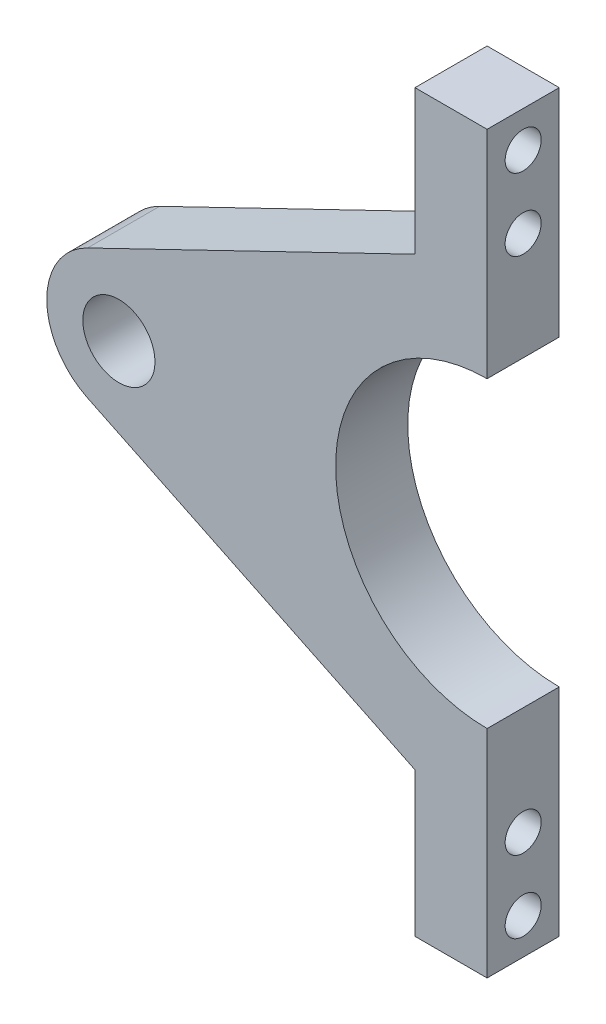
ISO-10303-21;
HEADER;
FILE_DESCRIPTION(('STEP AP214'),'2;1');
FILE_NAME('part.step','',(''),(''),'','','');
FILE_SCHEMA(('AUTOMOTIVE_DESIGN { 1 0 10303 214 1 1 1 1 }'));
ENDSEC;
DATA;
#1=APPLICATION_CONTEXT('core data for automotive mechanical design processes');
#2=APPLICATION_PROTOCOL_DEFINITION('international standard','automotive_design',2000,#1);
#3=PRODUCT_CONTEXT('',#1,'mechanical');
#4=PRODUCT('Part','Part','',(#3));
#5=PRODUCT_RELATED_PRODUCT_CATEGORY('part','',(#4));
#6=PRODUCT_DEFINITION_FORMATION('','',#4);
#7=PRODUCT_DEFINITION_CONTEXT('part definition',#1,'design');
#8=PRODUCT_DEFINITION('design','',#6,#7);
#9=PRODUCT_DEFINITION_SHAPE('','',#8);
#10=(LENGTH_UNIT() NAMED_UNIT(*) SI_UNIT(.MILLI.,.METRE.));
#11=(NAMED_UNIT(*) PLANE_ANGLE_UNIT() SI_UNIT($,.RADIAN.));
#12=(NAMED_UNIT(*) SI_UNIT($,.STERADIAN.) SOLID_ANGLE_UNIT());
#13=UNCERTAINTY_MEASURE_WITH_UNIT(LENGTH_MEASURE(1.E-05),#10,'distance_accuracy_value','');
#14=(GEOMETRIC_REPRESENTATION_CONTEXT(3) GLOBAL_UNCERTAINTY_ASSIGNED_CONTEXT((#13)) GLOBAL_UNIT_ASSIGNED_CONTEXT((#10,
#11,#12)) REPRESENTATION_CONTEXT('',''));
#15=CARTESIAN_POINT('',(0.,0.,0.));
#16=DIRECTION('',(0.,0.,1.));
#17=DIRECTION('',(1.,0.,0.));
#18=AXIS2_PLACEMENT_3D('',#15,#16,#17);
#19=CARTESIAN_POINT('',(0.,54.25,-10.));
#20=DIRECTION('',(0.,1.,0.));
#21=DIRECTION('',(0.,0.,1.));
#22=AXIS2_PLACEMENT_3D('',#19,#20,#21);
#23=PLANE('',#22);
#24=DIRECTION('',(-1.,0.,0.));
#25=VECTOR('',#24,1.);
#26=CARTESIAN_POINT('',(0.,54.25,0.));
#27=LINE('',#26,#25);
#28=CARTESIAN_POINT('',(0.,54.25,0.));
#29=VERTEX_POINT('',#28);
#30=CARTESIAN_POINT('',(-10.,54.25,0.));
#31=VERTEX_POINT('',#30);
#32=EDGE_CURVE('E141',#29,#31,#27,.T.);
#33=ORIENTED_EDGE('',*,*,#32,.F.);
#34=DIRECTION('',(0.,0.,1.));
#35=VECTOR('',#34,1.);
#36=CARTESIAN_POINT('',(0.,54.25,-10.));
#37=LINE('',#36,#35);
#38=CARTESIAN_POINT('',(0.,54.25,-10.));
#39=VERTEX_POINT('',#38);
#40=EDGE_CURVE('E11',#39,#29,#37,.T.);
#41=ORIENTED_EDGE('',*,*,#40,.F.);
#42=DIRECTION('',(-1.,0.,0.));
#43=VECTOR('',#42,1.);
#44=CARTESIAN_POINT('',(0.,54.25,-10.));
#45=LINE('',#44,#43);
#46=CARTESIAN_POINT('',(-10.,54.25,-10.));
#47=VERTEX_POINT('',#46);
#48=EDGE_CURVE('E168',#39,#47,#45,.T.);
#49=ORIENTED_EDGE('',*,*,#48,.T.);
#50=DIRECTION('',(0.,0.,1.));
#51=VECTOR('',#50,1.);
#52=CARTESIAN_POINT('',(-10.,54.25,-10.));
#53=LINE('',#52,#51);
#54=EDGE_CURVE('E35',#47,#31,#53,.T.);
#55=ORIENTED_EDGE('',*,*,#54,.T.);
#56=EDGE_LOOP('',(#33,#41,#49,#55));
#57=FACE_BOUND('',#56,.T.);
#58=ADVANCED_FACE('F32',(#57),#23,.T.);
#59=CARTESIAN_POINT('',(0.,24.2996794871795,-10.));
#60=DIRECTION('',(1.,0.,0.));
#61=DIRECTION('',(0.,0.,-1.));
#62=AXIS2_PLACEMENT_3D('',#59,#60,#61);
#63=PLANE('',#62);
#64=CARTESIAN_POINT('',(0.,49.25,-5.));
#65=DIRECTION('',(-1.,0.,0.));
#66=DIRECTION('',(0.,0.,1.));
#67=AXIS2_PLACEMENT_3D('',#64,#65,#66);
#68=CIRCLE('',#67,2.5);
#69=CARTESIAN_POINT('',(0.,49.25,-2.5));
#70=VERTEX_POINT('',#69);
#71=EDGE_CURVE('E257',#70,#70,#68,.T.);
#72=ORIENTED_EDGE('',*,*,#71,.T.);
#73=EDGE_LOOP('',(#72));
#74=FACE_BOUND('',#73,.T.);
#75=CARTESIAN_POINT('',(0.,39.25,-5.));
#76=DIRECTION('',(-1.,0.,0.));
#77=DIRECTION('',(0.,0.,1.));
#78=AXIS2_PLACEMENT_3D('',#75,#76,#77);
#79=CIRCLE('',#78,2.5);
#80=CARTESIAN_POINT('',(0.,39.25,-2.5));
#81=VERTEX_POINT('',#80);
#82=EDGE_CURVE('E234',#81,#81,#79,.T.);
#83=ORIENTED_EDGE('',*,*,#82,.T.);
#84=EDGE_LOOP('',(#83));
#85=FACE_BOUND('',#84,.T.);
#86=DIRECTION('',(0.,1.,0.));
#87=VECTOR('',#86,1.);
#88=CARTESIAN_POINT('',(0.,24.2996794871795,0.));
#89=LINE('',#88,#87);
#90=CARTESIAN_POINT('',(0.,24.2996794871795,0.));
#91=VERTEX_POINT('',#90);
#92=EDGE_CURVE('E166',#91,#29,#89,.T.);
#93=ORIENTED_EDGE('',*,*,#92,.F.);
#94=DIRECTION('',(0.,0.,1.));
#95=VECTOR('',#94,1.);
#96=CARTESIAN_POINT('',(0.,24.2996794871795,-10.));
#97=LINE('',#96,#95);
#98=CARTESIAN_POINT('',(0.,24.2996794871795,-10.));
#99=VERTEX_POINT('',#98);
#100=EDGE_CURVE('E41',#99,#91,#97,.T.);
#101=ORIENTED_EDGE('',*,*,#100,.F.);
#102=DIRECTION('',(0.,1.,0.));
#103=VECTOR('',#102,1.);
#104=CARTESIAN_POINT('',(0.,24.2996794871795,-10.));
#105=LINE('',#104,#103);
#106=EDGE_CURVE('E131',#99,#39,#105,.T.);
#107=ORIENTED_EDGE('',*,*,#106,.T.);
#108=ORIENTED_EDGE('',*,*,#40,.T.);
#109=EDGE_LOOP('',(#93,#101,#107,#108));
#110=FACE_BOUND('',#109,.T.);
#111=ADVANCED_FACE('F184',(#74,#85,#110),#63,.T.);
#112=CARTESIAN_POINT('',(0.,3.29967948717947,-10.));
#113=DIRECTION('',(0.,0.,1.));
#114=DIRECTION('',(1.,0.,0.));
#115=AXIS2_PLACEMENT_3D('',#112,#113,#114);
#116=CYLINDRICAL_SURFACE('',#115,21.);
#117=CARTESIAN_POINT('',(0.,3.29967948717947,0.));
#118=DIRECTION('',(0.,0.,-1.));
#119=DIRECTION('',(1.,0.,0.));
#120=AXIS2_PLACEMENT_3D('',#117,#118,#119);
#121=CIRCLE('',#120,21.);
#122=CARTESIAN_POINT('',(0.,-17.7003205128205,0.));
#123=VERTEX_POINT('',#122);
#124=EDGE_CURVE('E118',#123,#91,#121,.T.);
#125=ORIENTED_EDGE('',*,*,#124,.F.);
#126=DIRECTION('',(0.,0.,1.));
#127=VECTOR('',#126,1.);
#128=CARTESIAN_POINT('',(0.,-17.7003205128205,-10.));
#129=LINE('',#128,#127);
#130=CARTESIAN_POINT('',(0.,-17.7003205128205,-10.));
#131=VERTEX_POINT('',#130);
#132=EDGE_CURVE('E113',#131,#123,#129,.T.);
#133=ORIENTED_EDGE('',*,*,#132,.F.);
#134=CARTESIAN_POINT('',(0.,3.29967948717947,-10.));
#135=DIRECTION('',(0.,0.,-1.));
#136=DIRECTION('',(1.,0.,0.));
#137=AXIS2_PLACEMENT_3D('',#134,#135,#136);
#138=CIRCLE('',#137,21.);
#139=EDGE_CURVE('E116',#131,#99,#138,.T.);
#140=ORIENTED_EDGE('',*,*,#139,.T.);
#141=ORIENTED_EDGE('',*,*,#100,.T.);
#142=EDGE_LOOP('',(#125,#133,#140,#141));
#143=FACE_BOUND('',#142,.T.);
#144=ADVANCED_FACE('F115',(#143),#116,.F.);
#145=CARTESIAN_POINT('',(0.,-17.7003205128205,-10.));
#146=DIRECTION('',(1.,0.,0.));
#147=DIRECTION('',(0.,1.,0.));
#148=AXIS2_PLACEMENT_3D('',#145,#146,#147);
#149=PLANE('',#148);
#150=CARTESIAN_POINT('',(0.,-32.6506410256411,-5.));
#151=DIRECTION('',(-1.,0.,0.));
#152=DIRECTION('',(0.,0.,-1.));
#153=AXIS2_PLACEMENT_3D('',#150,#151,#152);
#154=CIRCLE('',#153,2.5);
#155=CARTESIAN_POINT('',(0.,-32.6506410256411,-7.5));
#156=VERTEX_POINT('',#155);
#157=EDGE_CURVE('E235',#156,#156,#154,.T.);
#158=ORIENTED_EDGE('',*,*,#157,.T.);
#159=EDGE_LOOP('',(#158));
#160=FACE_BOUND('',#159,.T.);
#161=CARTESIAN_POINT('',(0.,-42.6506410256411,-5.));
#162=DIRECTION('',(-1.,0.,0.));
#163=DIRECTION('',(0.,0.,-1.));
#164=AXIS2_PLACEMENT_3D('',#161,#162,#163);
#165=CIRCLE('',#164,2.5);
#166=CARTESIAN_POINT('',(0.,-42.6506410256411,-7.5));
#167=VERTEX_POINT('',#166);
#168=EDGE_CURVE('E246',#167,#167,#165,.T.);
#169=ORIENTED_EDGE('',*,*,#168,.T.);
#170=EDGE_LOOP('',(#169));
#171=FACE_BOUND('',#170,.T.);
#172=DIRECTION('',(0.,1.,0.));
#173=VECTOR('',#172,1.);
#174=CARTESIAN_POINT('',(0.,-17.7003205128205,0.));
#175=LINE('',#174,#173);
#176=CARTESIAN_POINT('',(0.,-47.6506410256411,0.));
#177=VERTEX_POINT('',#176);
#178=EDGE_CURVE('E163',#177,#123,#175,.T.);
#179=ORIENTED_EDGE('',*,*,#178,.F.);
#180=DIRECTION('',(0.,0.,1.));
#181=VECTOR('',#180,1.);
#182=CARTESIAN_POINT('',(0.,-47.6506410256411,-10.));
#183=LINE('',#182,#181);
#184=CARTESIAN_POINT('',(0.,-47.6506410256411,-10.));
#185=VERTEX_POINT('',#184);
#186=EDGE_CURVE('E123',#185,#177,#183,.T.);
#187=ORIENTED_EDGE('',*,*,#186,.F.);
#188=DIRECTION('',(0.,1.,0.));
#189=VECTOR('',#188,1.);
#190=CARTESIAN_POINT('',(0.,-17.7003205128205,-10.));
#191=LINE('',#190,#189);
#192=EDGE_CURVE('E129',#185,#131,#191,.T.);
#193=ORIENTED_EDGE('',*,*,#192,.T.);
#194=ORIENTED_EDGE('',*,*,#132,.T.);
#195=EDGE_LOOP('',(#179,#187,#193,#194));
#196=FACE_BOUND('',#195,.T.);
#197=ADVANCED_FACE('F133',(#160,#171,#196),#149,.T.);
#198=CARTESIAN_POINT('',(0.,-47.6506410256411,-10.));
#199=DIRECTION('',(0.,-1.,0.));
#200=DIRECTION('',(0.,0.,-1.));
#201=AXIS2_PLACEMENT_3D('',#198,#199,#200);
#202=PLANE('',#201);
#203=DIRECTION('',(1.,0.,0.));
#204=VECTOR('',#203,1.);
#205=CARTESIAN_POINT('',(0.,-47.6506410256411,0.));
#206=LINE('',#205,#204);
#207=CARTESIAN_POINT('',(-9.99999999999999,-47.6506410256411,0.));
#208=VERTEX_POINT('',#207);
#209=EDGE_CURVE('E160',#208,#177,#206,.T.);
#210=ORIENTED_EDGE('',*,*,#209,.F.);
#211=DIRECTION('',(0.,0.,1.));
#212=VECTOR('',#211,1.);
#213=CARTESIAN_POINT('',(-9.99999999999999,-47.6506410256411,-10.));
#214=LINE('',#213,#212);
#215=CARTESIAN_POINT('',(-9.99999999999999,-47.6506410256411,-10.));
#216=VERTEX_POINT('',#215);
#217=EDGE_CURVE('E172',#216,#208,#214,.T.);
#218=ORIENTED_EDGE('',*,*,#217,.F.);
#219=DIRECTION('',(1.,0.,0.));
#220=VECTOR('',#219,1.);
#221=CARTESIAN_POINT('',(0.,-47.6506410256411,-10.));
#222=LINE('',#221,#220);
#223=EDGE_CURVE('E134',#216,#185,#222,.T.);
#224=ORIENTED_EDGE('',*,*,#223,.T.);
#225=ORIENTED_EDGE('',*,*,#186,.T.);
#226=EDGE_LOOP('',(#210,#218,#224,#225));
#227=FACE_BOUND('',#226,.T.);
#228=ADVANCED_FACE('F200',(#227),#202,.T.);
#229=CARTESIAN_POINT('',(-9.99999999999999,-47.6506410256411,-10.));
#230=DIRECTION('',(-1.,0.,0.));
#231=DIRECTION('',(0.,-1.,0.));
#232=AXIS2_PLACEMENT_3D('',#229,#230,#231);
#233=PLANE('',#232);
#234=CARTESIAN_POINT('',(-10.,-32.6506410256411,-5.));
#235=DIRECTION('',(-1.,0.,0.));
#236=DIRECTION('',(0.,0.,-1.));
#237=AXIS2_PLACEMENT_3D('',#234,#235,#236);
#238=CIRCLE('',#237,2.5);
#239=CARTESIAN_POINT('',(-10.,-32.6506410256411,-7.5));
#240=VERTEX_POINT('',#239);
#241=EDGE_CURVE('E240',#240,#240,#238,.T.);
#242=ORIENTED_EDGE('',*,*,#241,.F.);
#243=EDGE_LOOP('',(#242));
#244=FACE_BOUND('',#243,.T.);
#245=CARTESIAN_POINT('',(-10.,-42.6506410256411,-5.));
#246=DIRECTION('',(-1.,0.,0.));
#247=DIRECTION('',(0.,0.,-1.));
#248=AXIS2_PLACEMENT_3D('',#245,#246,#247);
#249=CIRCLE('',#248,2.5);
#250=CARTESIAN_POINT('',(-10.,-42.6506410256411,-7.5));
#251=VERTEX_POINT('',#250);
#252=EDGE_CURVE('E249',#251,#251,#249,.T.);
#253=ORIENTED_EDGE('',*,*,#252,.F.);
#254=EDGE_LOOP('',(#253));
#255=FACE_BOUND('',#254,.T.);
#256=DIRECTION('',(0.,-1.,0.));
#257=VECTOR('',#256,1.);
#258=CARTESIAN_POINT('',(-9.99999999999999,-47.6506410256411,0.));
#259=LINE('',#258,#257);
#260=CARTESIAN_POINT('',(-9.99999999999999,-27.650641025641,0.));
#261=VERTEX_POINT('',#260);
#262=EDGE_CURVE('E157',#261,#208,#259,.T.);
#263=ORIENTED_EDGE('',*,*,#262,.F.);
#264=DIRECTION('',(0.,0.,1.));
#265=VECTOR('',#264,1.);
#266=CARTESIAN_POINT('',(-9.99999999999999,-27.650641025641,-10.));
#267=LINE('',#266,#265);
#268=CARTESIAN_POINT('',(-9.99999999999999,-27.650641025641,-10.));
#269=VERTEX_POINT('',#268);
#270=EDGE_CURVE('E174',#269,#261,#267,.T.);
#271=ORIENTED_EDGE('',*,*,#270,.F.);
#272=DIRECTION('',(0.,-1.,0.));
#273=VECTOR('',#272,1.);
#274=CARTESIAN_POINT('',(-9.99999999999999,-47.6506410256411,-10.));
#275=LINE('',#274,#273);
#276=EDGE_CURVE('E136',#269,#216,#275,.T.);
#277=ORIENTED_EDGE('',*,*,#276,.T.);
#278=ORIENTED_EDGE('',*,*,#217,.T.);
#279=EDGE_LOOP('',(#263,#271,#277,#278));
#280=FACE_BOUND('',#279,.T.);
#281=ADVANCED_FACE('F204',(#244,#255,#280),#233,.T.);
#282=CARTESIAN_POINT('',(-9.99999999999999,-27.650641025641,-10.));
#283=DIRECTION('',(-0.435227541755653,-0.900320491212619,0.));
#284=DIRECTION('',(0.900320491212619,-0.435227541755653,0.));
#285=AXIS2_PLACEMENT_3D('',#282,#283,#284);
#286=PLANE('',#285);
#287=DIRECTION('',(0.900320491212619,-0.435227541755653,0.));
#288=VECTOR('',#287,1.);
#289=CARTESIAN_POINT('',(-9.99999999999999,-27.650641025641,0.));
#290=LINE('',#289,#288);
#291=CARTESIAN_POINT('',(-55.4002470032345,-5.7035254249468,0.));
#292=VERTEX_POINT('',#291);
#293=EDGE_CURVE('E154',#292,#261,#290,.T.);
#294=ORIENTED_EDGE('',*,*,#293,.F.);
#295=DIRECTION('',(0.,0.,1.));
#296=VECTOR('',#295,1.);
#297=CARTESIAN_POINT('',(-55.4002470032345,-5.7035254249468,-10.));
#298=LINE('',#297,#296);
#299=CARTESIAN_POINT('',(-55.4002470032345,-5.7035254249468,-10.));
#300=VERTEX_POINT('',#299);
#301=EDGE_CURVE('E176',#300,#292,#298,.T.);
#302=ORIENTED_EDGE('',*,*,#301,.F.);
#303=DIRECTION('',(0.900320491212619,-0.435227541755653,0.));
#304=VECTOR('',#303,1.);
#305=CARTESIAN_POINT('',(-9.99999999999999,-27.650641025641,-10.));
#306=LINE('',#305,#304);
#307=EDGE_CURVE('E267',#300,#269,#306,.T.);
#308=ORIENTED_EDGE('',*,*,#307,.T.);
#309=ORIENTED_EDGE('',*,*,#270,.T.);
#310=EDGE_LOOP('',(#294,#302,#308,#309));
#311=FACE_BOUND('',#310,.T.);
#312=ADVANCED_FACE('F208',(#311),#286,.T.);
#313=CARTESIAN_POINT('',(-51.0479715856781,3.29967948717947,-10.));
#314=DIRECTION('',(0.,0.,1.));
#315=DIRECTION('',(1.,0.,0.));
#316=AXIS2_PLACEMENT_3D('',#313,#314,#315);
#317=CYLINDRICAL_SURFACE('',#316,10.);
#318=CARTESIAN_POINT('',(-51.0479715856781,3.29967948717947,0.));
#319=DIRECTION('',(0.,0.,1.));
#320=DIRECTION('',(1.,0.,0.));
#321=AXIS2_PLACEMENT_3D('',#318,#319,#320);
#322=CIRCLE('',#321,10.);
#323=CARTESIAN_POINT('',(-55.4002470032345,12.3028843993057,0.));
#324=VERTEX_POINT('',#323);
#325=EDGE_CURVE('E151',#324,#292,#322,.T.);
#326=ORIENTED_EDGE('',*,*,#325,.F.);
#327=DIRECTION('',(0.,0.,1.));
#328=VECTOR('',#327,1.);
#329=CARTESIAN_POINT('',(-55.4002470032345,12.3028843993057,-10.));
#330=LINE('',#329,#328);
#331=CARTESIAN_POINT('',(-55.4002470032345,12.3028843993057,-10.));
#332=VERTEX_POINT('',#331);
#333=EDGE_CURVE('E178',#332,#324,#330,.T.);
#334=ORIENTED_EDGE('',*,*,#333,.F.);
#335=CARTESIAN_POINT('',(-51.0479715856781,3.29967948717947,-10.));
#336=DIRECTION('',(0.,0.,1.));
#337=DIRECTION('',(1.,0.,0.));
#338=AXIS2_PLACEMENT_3D('',#335,#336,#337);
#339=CIRCLE('',#338,10.);
#340=EDGE_CURVE('E264',#332,#300,#339,.T.);
#341=ORIENTED_EDGE('',*,*,#340,.T.);
#342=ORIENTED_EDGE('',*,*,#301,.T.);
#343=EDGE_LOOP('',(#326,#334,#341,#342));
#344=FACE_BOUND('',#343,.T.);
#345=ADVANCED_FACE('F212',(#344),#317,.T.);
#346=CARTESIAN_POINT('',(-10.,34.25,-10.));
#347=DIRECTION('',(-0.435227541755653,0.900320491212619,0.));
#348=DIRECTION('',(-0.900320491212619,-0.435227541755653,0.));
#349=AXIS2_PLACEMENT_3D('',#346,#347,#348);
#350=PLANE('',#349);
#351=DIRECTION('',(-0.900320491212619,-0.435227541755653,0.));
#352=VECTOR('',#351,1.);
#353=CARTESIAN_POINT('',(-10.,34.25,0.));
#354=LINE('',#353,#352);
#355=CARTESIAN_POINT('',(-10.,34.25,0.));
#356=VERTEX_POINT('',#355);
#357=EDGE_CURVE('E148',#356,#324,#354,.T.);
#358=ORIENTED_EDGE('',*,*,#357,.F.);
#359=DIRECTION('',(0.,0.,1.));
#360=VECTOR('',#359,1.);
#361=CARTESIAN_POINT('',(-10.,34.25,-10.));
#362=LINE('',#361,#360);
#363=CARTESIAN_POINT('',(-10.,34.25,-10.));
#364=VERTEX_POINT('',#363);
#365=EDGE_CURVE('E179',#364,#356,#362,.T.);
#366=ORIENTED_EDGE('',*,*,#365,.F.);
#367=DIRECTION('',(-0.900320491212619,-0.435227541755653,0.));
#368=VECTOR('',#367,1.);
#369=CARTESIAN_POINT('',(-10.,34.25,-10.));
#370=LINE('',#369,#368);
#371=EDGE_CURVE('E261',#364,#332,#370,.T.);
#372=ORIENTED_EDGE('',*,*,#371,.T.);
#373=ORIENTED_EDGE('',*,*,#333,.T.);
#374=EDGE_LOOP('',(#358,#366,#372,#373));
#375=FACE_BOUND('',#374,.T.);
#376=ADVANCED_FACE('F216',(#375),#350,.T.);
#377=CARTESIAN_POINT('',(-10.,54.25,-10.));
#378=DIRECTION('',(-1.,0.,0.));
#379=DIRECTION('',(0.,0.,1.));
#380=AXIS2_PLACEMENT_3D('',#377,#378,#379);
#381=PLANE('',#380);
#382=CARTESIAN_POINT('',(-10.,49.25,-5.));
#383=DIRECTION('',(-1.,0.,0.));
#384=DIRECTION('',(0.,0.,1.));
#385=AXIS2_PLACEMENT_3D('',#382,#383,#384);
#386=CIRCLE('',#385,2.5);
#387=CARTESIAN_POINT('',(-10.,49.25,-2.5));
#388=VERTEX_POINT('',#387);
#389=EDGE_CURVE('E229',#388,#388,#386,.T.);
#390=ORIENTED_EDGE('',*,*,#389,.F.);
#391=EDGE_LOOP('',(#390));
#392=FACE_BOUND('',#391,.T.);
#393=CARTESIAN_POINT('',(-10.,39.25,-5.));
#394=DIRECTION('',(-1.,0.,0.));
#395=DIRECTION('',(0.,0.,1.));
#396=AXIS2_PLACEMENT_3D('',#393,#394,#395);
#397=CIRCLE('',#396,2.5);
#398=CARTESIAN_POINT('',(-10.,39.25,-2.5));
#399=VERTEX_POINT('',#398);
#400=EDGE_CURVE('E232',#399,#399,#397,.T.);
#401=ORIENTED_EDGE('',*,*,#400,.F.);
#402=EDGE_LOOP('',(#401));
#403=FACE_BOUND('',#402,.T.);
#404=DIRECTION('',(0.,-1.,0.));
#405=VECTOR('',#404,1.);
#406=CARTESIAN_POINT('',(-10.,54.25,0.));
#407=LINE('',#406,#405);
#408=EDGE_CURVE('E144',#31,#356,#407,.T.);
#409=ORIENTED_EDGE('',*,*,#408,.F.);
#410=ORIENTED_EDGE('',*,*,#54,.F.);
#411=DIRECTION('',(0.,-1.,0.));
#412=VECTOR('',#411,1.);
#413=CARTESIAN_POINT('',(-10.,54.25,-10.));
#414=LINE('',#413,#412);
#415=EDGE_CURVE('E259',#47,#364,#414,.T.);
#416=ORIENTED_EDGE('',*,*,#415,.T.);
#417=ORIENTED_EDGE('',*,*,#365,.T.);
#418=EDGE_LOOP('',(#409,#410,#416,#417));
#419=FACE_BOUND('',#418,.T.);
#420=ADVANCED_FACE('F181',(#392,#403,#419),#381,.T.);
#421=CARTESIAN_POINT('',(-51.0479715856781,3.29967948717947,-10.));
#422=DIRECTION('',(0.,0.,1.));
#423=DIRECTION('',(1.,0.,0.));
#424=AXIS2_PLACEMENT_3D('',#421,#422,#423);
#425=PLANE('',#424);
#426=CARTESIAN_POINT('',(-51.0479715856781,3.29967948717947,-10.));
#427=DIRECTION('',(0.,0.,1.));
#428=DIRECTION('',(1.,0.,0.));
#429=AXIS2_PLACEMENT_3D('',#426,#427,#428);
#430=CIRCLE('',#429,5.);
#431=CARTESIAN_POINT('',(-46.0479715856781,3.29967948717947,-10.));
#432=VERTEX_POINT('',#431);
#433=EDGE_CURVE('E145',#432,#432,#430,.T.);
#434=ORIENTED_EDGE('',*,*,#433,.T.);
#435=EDGE_LOOP('',(#434));
#436=FACE_BOUND('',#435,.T.);
#437=ORIENTED_EDGE('',*,*,#48,.F.);
#438=ORIENTED_EDGE('',*,*,#106,.F.);
#439=ORIENTED_EDGE('',*,*,#139,.F.);
#440=ORIENTED_EDGE('',*,*,#192,.F.);
#441=ORIENTED_EDGE('',*,*,#223,.F.);
#442=ORIENTED_EDGE('',*,*,#276,.F.);
#443=ORIENTED_EDGE('',*,*,#307,.F.);
#444=ORIENTED_EDGE('',*,*,#340,.F.);
#445=ORIENTED_EDGE('',*,*,#371,.F.);
#446=ORIENTED_EDGE('',*,*,#415,.F.);
#447=EDGE_LOOP('',(#437,#438,#439,#440,#441,#442,#443,#444,#445,#446));
#448=FACE_BOUND('',#447,.T.);
#449=ADVANCED_FACE('F127',(#436,#448),#425,.F.);
#450=CARTESIAN_POINT('',(-51.0479715856781,3.29967948717947,0.));
#451=DIRECTION('',(0.,0.,1.));
#452=DIRECTION('',(1.,0.,0.));
#453=AXIS2_PLACEMENT_3D('',#450,#451,#452);
#454=PLANE('',#453);
#455=CARTESIAN_POINT('',(-51.0479715856781,3.29967948717947,0.));
#456=DIRECTION('',(0.,0.,1.));
#457=DIRECTION('',(1.,0.,0.));
#458=AXIS2_PLACEMENT_3D('',#455,#456,#457);
#459=CIRCLE('',#458,5.);
#460=CARTESIAN_POINT('',(-46.0479715856781,3.29967948717947,0.));
#461=VERTEX_POINT('',#460);
#462=EDGE_CURVE('E254',#461,#461,#459,.T.);
#463=ORIENTED_EDGE('',*,*,#462,.F.);
#464=EDGE_LOOP('',(#463));
#465=FACE_BOUND('',#464,.T.);
#466=ORIENTED_EDGE('',*,*,#32,.T.);
#467=ORIENTED_EDGE('',*,*,#408,.T.);
#468=ORIENTED_EDGE('',*,*,#357,.T.);
#469=ORIENTED_EDGE('',*,*,#325,.T.);
#470=ORIENTED_EDGE('',*,*,#293,.T.);
#471=ORIENTED_EDGE('',*,*,#262,.T.);
#472=ORIENTED_EDGE('',*,*,#209,.T.);
#473=ORIENTED_EDGE('',*,*,#178,.T.);
#474=ORIENTED_EDGE('',*,*,#124,.T.);
#475=ORIENTED_EDGE('',*,*,#92,.T.);
#476=EDGE_LOOP('',(#466,#467,#468,#469,#470,#471,#472,#473,#474,#475));
#477=FACE_BOUND('',#476,.T.);
#478=ADVANCED_FACE('F183',(#465,#477),#454,.T.);
#479=CARTESIAN_POINT('',(-51.0479715856781,3.29967948717947,-10.));
#480=DIRECTION('',(0.,0.,1.));
#481=DIRECTION('',(1.,0.,0.));
#482=AXIS2_PLACEMENT_3D('',#479,#480,#481);
#483=CYLINDRICAL_SURFACE('',#482,5.);
#484=ORIENTED_EDGE('',*,*,#433,.F.);
#485=EDGE_LOOP('',(#484));
#486=FACE_BOUND('',#485,.T.);
#487=ORIENTED_EDGE('',*,*,#462,.T.);
#488=EDGE_LOOP('',(#487));
#489=FACE_BOUND('',#488,.T.);
#490=ADVANCED_FACE('F297',(#486,#489),#483,.F.);
#491=CARTESIAN_POINT('',(0.,39.25,-5.));
#492=DIRECTION('',(-1.,0.,0.));
#493=DIRECTION('',(0.,0.,1.));
#494=AXIS2_PLACEMENT_3D('',#491,#492,#493);
#495=CYLINDRICAL_SURFACE('',#494,2.5);
#496=ORIENTED_EDGE('',*,*,#82,.F.);
#497=EDGE_LOOP('',(#496));
#498=FACE_BOUND('',#497,.T.);
#499=ORIENTED_EDGE('',*,*,#400,.T.);
#500=EDGE_LOOP('',(#499));
#501=FACE_BOUND('',#500,.T.);
#502=ADVANCED_FACE('F287',(#498,#501),#495,.F.);
#503=CARTESIAN_POINT('',(0.,49.25,-5.));
#504=DIRECTION('',(-1.,0.,0.));
#505=DIRECTION('',(0.,0.,1.));
#506=AXIS2_PLACEMENT_3D('',#503,#504,#505);
#507=CYLINDRICAL_SURFACE('',#506,2.5);
#508=ORIENTED_EDGE('',*,*,#71,.F.);
#509=EDGE_LOOP('',(#508));
#510=FACE_BOUND('',#509,.T.);
#511=ORIENTED_EDGE('',*,*,#389,.T.);
#512=EDGE_LOOP('',(#511));
#513=FACE_BOUND('',#512,.T.);
#514=ADVANCED_FACE('F284',(#510,#513),#507,.F.);
#515=CARTESIAN_POINT('',(0.,-42.6506410256411,-5.));
#516=DIRECTION('',(-1.,0.,0.));
#517=DIRECTION('',(0.,0.,1.));
#518=AXIS2_PLACEMENT_3D('',#515,#516,#517);
#519=CYLINDRICAL_SURFACE('',#518,2.5);
#520=ORIENTED_EDGE('',*,*,#168,.F.);
#521=EDGE_LOOP('',(#520));
#522=FACE_BOUND('',#521,.T.);
#523=ORIENTED_EDGE('',*,*,#252,.T.);
#524=EDGE_LOOP('',(#523));
#525=FACE_BOUND('',#524,.T.);
#526=ADVANCED_FACE('F286',(#522,#525),#519,.F.);
#527=CARTESIAN_POINT('',(0.,-32.6506410256411,-5.));
#528=DIRECTION('',(-1.,0.,0.));
#529=DIRECTION('',(0.,0.,1.));
#530=AXIS2_PLACEMENT_3D('',#527,#528,#529);
#531=CYLINDRICAL_SURFACE('',#530,2.5);
#532=ORIENTED_EDGE('',*,*,#157,.F.);
#533=EDGE_LOOP('',(#532));
#534=FACE_BOUND('',#533,.T.);
#535=ORIENTED_EDGE('',*,*,#241,.T.);
#536=EDGE_LOOP('',(#535));
#537=FACE_BOUND('',#536,.T.);
#538=ADVANCED_FACE('F294',(#534,#537),#531,.F.);
#539=CLOSED_SHELL('',(#58,#111,#144,#197,#228,#281,#312,#345,#376,#420,#449,#478,#490,#502,#514,
#526,#538));
#540=MANIFOLD_SOLID_BREP('B2',#539);
#541=ADVANCED_BREP_SHAPE_REPRESENTATION('',(#18,#540),#14);
#542=SHAPE_DEFINITION_REPRESENTATION(#9,#541);
ENDSEC;
END-ISO-10303-21;
